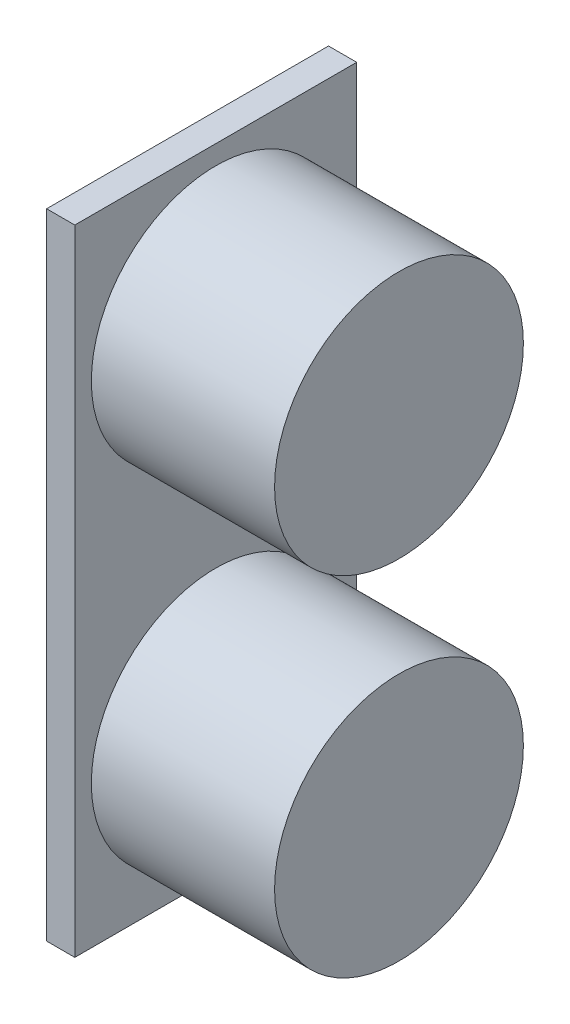
ISO-10303-21;
HEADER;
FILE_DESCRIPTION(('STEP AP214'),'2;1');
FILE_NAME('part.step','',(''),(''),'','','');
FILE_SCHEMA(('AUTOMOTIVE_DESIGN { 1 0 10303 214 1 1 1 1 }'));
ENDSEC;
DATA;
#1=APPLICATION_CONTEXT('core data for automotive mechanical design processes');
#2=APPLICATION_PROTOCOL_DEFINITION('international standard','automotive_design',2000,#1);
#3=PRODUCT_CONTEXT('',#1,'mechanical');
#4=PRODUCT('Part','Part','',(#3));
#5=PRODUCT_RELATED_PRODUCT_CATEGORY('part','',(#4));
#6=PRODUCT_DEFINITION_FORMATION('','',#4);
#7=PRODUCT_DEFINITION_CONTEXT('part definition',#1,'design');
#8=PRODUCT_DEFINITION('design','',#6,#7);
#9=PRODUCT_DEFINITION_SHAPE('','',#8);
#10=(LENGTH_UNIT() NAMED_UNIT(*) SI_UNIT(.MILLI.,.METRE.));
#11=(NAMED_UNIT(*) PLANE_ANGLE_UNIT() SI_UNIT($,.RADIAN.));
#12=(NAMED_UNIT(*) SI_UNIT($,.STERADIAN.) SOLID_ANGLE_UNIT());
#13=UNCERTAINTY_MEASURE_WITH_UNIT(LENGTH_MEASURE(1.E-05),#10,'distance_accuracy_value','');
#14=(GEOMETRIC_REPRESENTATION_CONTEXT(3) GLOBAL_UNCERTAINTY_ASSIGNED_CONTEXT((#13)) GLOBAL_UNIT_ASSIGNED_CONTEXT((#10,
#11,#12)) REPRESENTATION_CONTEXT('',''));
#15=CARTESIAN_POINT('',(0.,0.,0.));
#16=DIRECTION('',(0.,0.,1.));
#17=DIRECTION('',(1.,0.,0.));
#18=AXIS2_PLACEMENT_3D('',#15,#16,#17);
#19=CARTESIAN_POINT('',(2.,0.,0.));
#20=DIRECTION('',(0.,1.,0.));
#21=DIRECTION('',(0.,0.,1.));
#22=AXIS2_PLACEMENT_3D('',#19,#20,#21);
#23=PLANE('',#22);
#24=DIRECTION('',(0.,0.,-1.));
#25=VECTOR('',#24,1.);
#26=CARTESIAN_POINT('',(0.,0.,0.));
#27=LINE('',#26,#25);
#28=CARTESIAN_POINT('',(0.,0.,20.));
#29=VERTEX_POINT('',#28);
#30=CARTESIAN_POINT('',(0.,0.,0.));
#31=VERTEX_POINT('',#30);
#32=EDGE_CURVE('E117',#29,#31,#27,.T.);
#33=ORIENTED_EDGE('',*,*,#32,.T.);
#34=DIRECTION('',(-1.,0.,0.));
#35=VECTOR('',#34,1.);
#36=CARTESIAN_POINT('',(2.,0.,0.));
#37=LINE('',#36,#35);
#38=CARTESIAN_POINT('',(2.,0.,0.));
#39=VERTEX_POINT('',#38);
#40=EDGE_CURVE('E106',#39,#31,#37,.T.);
#41=ORIENTED_EDGE('',*,*,#40,.F.);
#42=DIRECTION('',(0.,0.,-1.));
#43=VECTOR('',#42,1.);
#44=CARTESIAN_POINT('',(2.,0.,0.));
#45=LINE('',#44,#43);
#46=CARTESIAN_POINT('',(2.,0.,20.));
#47=VERTEX_POINT('',#46);
#48=EDGE_CURVE('E98',#47,#39,#45,.T.);
#49=ORIENTED_EDGE('',*,*,#48,.F.);
#50=DIRECTION('',(-1.,0.,0.));
#51=VECTOR('',#50,1.);
#52=CARTESIAN_POINT('',(2.,0.,20.));
#53=LINE('',#52,#51);
#54=EDGE_CURVE('E113',#47,#29,#53,.T.);
#55=ORIENTED_EDGE('',*,*,#54,.T.);
#56=EDGE_LOOP('',(#33,#41,#49,#55));
#57=FACE_BOUND('',#56,.T.);
#58=ADVANCED_FACE('F45',(#57),#23,.F.);
#59=CARTESIAN_POINT('',(2.,0.,0.));
#60=DIRECTION('',(0.,0.,1.));
#61=DIRECTION('',(1.,0.,0.));
#62=AXIS2_PLACEMENT_3D('',#59,#60,#61);
#63=PLANE('',#62);
#64=DIRECTION('',(0.,1.,0.));
#65=VECTOR('',#64,1.);
#66=CARTESIAN_POINT('',(0.,0.,0.));
#67=LINE('',#66,#65);
#68=CARTESIAN_POINT('',(0.,45.,0.));
#69=VERTEX_POINT('',#68);
#70=EDGE_CURVE('E104',#31,#69,#67,.T.);
#71=ORIENTED_EDGE('',*,*,#70,.T.);
#72=DIRECTION('',(-1.,0.,0.));
#73=VECTOR('',#72,1.);
#74=CARTESIAN_POINT('',(2.,45.,0.));
#75=LINE('',#74,#73);
#76=CARTESIAN_POINT('',(2.,45.,0.));
#77=VERTEX_POINT('',#76);
#78=EDGE_CURVE('E102',#77,#69,#75,.T.);
#79=ORIENTED_EDGE('',*,*,#78,.F.);
#80=DIRECTION('',(0.,1.,0.));
#81=VECTOR('',#80,1.);
#82=CARTESIAN_POINT('',(2.,0.,0.));
#83=LINE('',#82,#81);
#84=EDGE_CURVE('E93',#39,#77,#83,.T.);
#85=ORIENTED_EDGE('',*,*,#84,.F.);
#86=ORIENTED_EDGE('',*,*,#40,.T.);
#87=EDGE_LOOP('',(#71,#79,#85,#86));
#88=FACE_BOUND('',#87,.T.);
#89=ADVANCED_FACE('F103',(#88),#63,.F.);
#90=CARTESIAN_POINT('',(2.,45.,0.));
#91=DIRECTION('',(0.,-1.,0.));
#92=DIRECTION('',(0.,0.,-1.));
#93=AXIS2_PLACEMENT_3D('',#90,#91,#92);
#94=PLANE('',#93);
#95=DIRECTION('',(0.,0.,1.));
#96=VECTOR('',#95,1.);
#97=CARTESIAN_POINT('',(0.,45.,0.));
#98=LINE('',#97,#96);
#99=CARTESIAN_POINT('',(0.,45.,20.));
#100=VERTEX_POINT('',#99);
#101=EDGE_CURVE('E79',#69,#100,#98,.T.);
#102=ORIENTED_EDGE('',*,*,#101,.T.);
#103=DIRECTION('',(-1.,0.,0.));
#104=VECTOR('',#103,1.);
#105=CARTESIAN_POINT('',(2.,45.,20.));
#106=LINE('',#105,#104);
#107=CARTESIAN_POINT('',(2.,45.,20.));
#108=VERTEX_POINT('',#107);
#109=EDGE_CURVE('E107',#108,#100,#106,.T.);
#110=ORIENTED_EDGE('',*,*,#109,.F.);
#111=DIRECTION('',(0.,0.,1.));
#112=VECTOR('',#111,1.);
#113=CARTESIAN_POINT('',(2.,45.,0.));
#114=LINE('',#113,#112);
#115=EDGE_CURVE('E96',#77,#108,#114,.T.);
#116=ORIENTED_EDGE('',*,*,#115,.F.);
#117=ORIENTED_EDGE('',*,*,#78,.T.);
#118=EDGE_LOOP('',(#102,#110,#116,#117));
#119=FACE_BOUND('',#118,.T.);
#120=ADVANCED_FACE('F109',(#119),#94,.F.);
#121=CARTESIAN_POINT('',(2.,0.,20.));
#122=DIRECTION('',(0.,0.,-1.));
#123=DIRECTION('',(-1.,0.,0.));
#124=AXIS2_PLACEMENT_3D('',#121,#122,#123);
#125=PLANE('',#124);
#126=DIRECTION('',(0.,-1.,0.));
#127=VECTOR('',#126,1.);
#128=CARTESIAN_POINT('',(0.,0.,20.));
#129=LINE('',#128,#127);
#130=EDGE_CURVE('E85',#100,#29,#129,.T.);
#131=ORIENTED_EDGE('',*,*,#130,.T.);
#132=ORIENTED_EDGE('',*,*,#54,.F.);
#133=DIRECTION('',(0.,-1.,0.));
#134=VECTOR('',#133,1.);
#135=CARTESIAN_POINT('',(2.,0.,20.));
#136=LINE('',#135,#134);
#137=EDGE_CURVE('E62',#108,#47,#136,.T.);
#138=ORIENTED_EDGE('',*,*,#137,.F.);
#139=ORIENTED_EDGE('',*,*,#109,.T.);
#140=EDGE_LOOP('',(#131,#132,#138,#139));
#141=FACE_BOUND('',#140,.T.);
#142=ADVANCED_FACE('F141',(#141),#125,.F.);
#143=CARTESIAN_POINT('',(2.,0.,0.));
#144=DIRECTION('',(-1.,0.,0.));
#145=DIRECTION('',(0.,0.,1.));
#146=AXIS2_PLACEMENT_3D('',#143,#144,#145);
#147=PLANE('',#146);
#148=CARTESIAN_POINT('',(2.,34.8146833251682,10.));
#149=DIRECTION('',(-1.,0.,0.));
#150=DIRECTION('',(0.,0.,1.));
#151=AXIS2_PLACEMENT_3D('',#148,#149,#150);
#152=CIRCLE('',#151,8.82628422603186);
#153=CARTESIAN_POINT('',(2.,34.8146833251682,18.8262842260319));
#154=VERTEX_POINT('',#153);
#155=EDGE_CURVE('E11',#154,#154,#152,.F.);
#156=ORIENTED_EDGE('',*,*,#155,.F.);
#157=EDGE_LOOP('',(#156));
#158=FACE_BOUND('',#157,.T.);
#159=CARTESIAN_POINT('',(2.,10.0962767318712,10.));
#160=DIRECTION('',(-1.,0.,0.));
#161=DIRECTION('',(0.,0.,1.));
#162=AXIS2_PLACEMENT_3D('',#159,#160,#161);
#163=CIRCLE('',#162,8.82628422603186);
#164=CARTESIAN_POINT('',(2.,10.0962767318712,18.8262842260319));
#165=VERTEX_POINT('',#164);
#166=EDGE_CURVE('E54',#165,#165,#163,.F.);
#167=ORIENTED_EDGE('',*,*,#166,.F.);
#168=EDGE_LOOP('',(#167));
#169=FACE_BOUND('',#168,.T.);
#170=ORIENTED_EDGE('',*,*,#48,.T.);
#171=ORIENTED_EDGE('',*,*,#84,.T.);
#172=ORIENTED_EDGE('',*,*,#115,.T.);
#173=ORIENTED_EDGE('',*,*,#137,.T.);
#174=EDGE_LOOP('',(#170,#171,#172,#173));
#175=FACE_BOUND('',#174,.T.);
#176=ADVANCED_FACE('F94',(#158,#169,#175),#147,.F.);
#177=CARTESIAN_POINT('',(0.,0.,0.));
#178=DIRECTION('',(-1.,0.,0.));
#179=DIRECTION('',(0.,0.,1.));
#180=AXIS2_PLACEMENT_3D('',#177,#178,#179);
#181=PLANE('',#180);
#182=ORIENTED_EDGE('',*,*,#32,.F.);
#183=ORIENTED_EDGE('',*,*,#130,.F.);
#184=ORIENTED_EDGE('',*,*,#101,.F.);
#185=ORIENTED_EDGE('',*,*,#70,.F.);
#186=EDGE_LOOP('',(#182,#183,#184,#185));
#187=FACE_BOUND('',#186,.T.);
#188=ADVANCED_FACE('F140',(#187),#181,.T.);
#189=CARTESIAN_POINT('',(15.,10.0962767318712,10.));
#190=DIRECTION('',(-1.,0.,0.));
#191=DIRECTION('',(0.,0.,1.));
#192=AXIS2_PLACEMENT_3D('',#189,#190,#191);
#193=CYLINDRICAL_SURFACE('',#192,8.82628422603186);
#194=CARTESIAN_POINT('',(15.,10.0962767318712,10.));
#195=DIRECTION('',(1.,0.,0.));
#196=DIRECTION('',(0.,0.,-1.));
#197=AXIS2_PLACEMENT_3D('',#194,#195,#196);
#198=CIRCLE('',#197,8.82628422603186);
#199=CARTESIAN_POINT('',(15.,10.0962767318712,18.8262842260319));
#200=VERTEX_POINT('',#199);
#201=EDGE_CURVE('E121',#200,#200,#198,.T.);
#202=CARTESIAN_POINT('',(15.,10.0962767318712,18.8262842260319));
#203=CARTESIAN_POINT('',(14.8645833333333,10.0962767318712,18.8262842260319));
#204=CARTESIAN_POINT('',(14.7291666666667,10.0962767318712,18.8262842260319));
#205=CARTESIAN_POINT('',(14.4583333333333,10.0962767318712,18.8262842260319));
#206=CARTESIAN_POINT('',(14.3229166666667,10.0962767318712,18.8262842260319));
#207=CARTESIAN_POINT('',(14.0520833333333,10.0962767318712,18.8262842260319));
#208=CARTESIAN_POINT('',(13.9166666666667,10.0962767318712,18.8262842260319));
#209=CARTESIAN_POINT('',(13.6458333333333,10.0962767318712,18.8262842260319));
#210=CARTESIAN_POINT('',(13.5104166666667,10.0962767318712,18.8262842260319));
#211=CARTESIAN_POINT('',(13.2395833333333,10.0962767318712,18.8262842260319));
#212=CARTESIAN_POINT('',(13.1041666666667,10.0962767318712,18.8262842260319));
#213=CARTESIAN_POINT('',(12.8333333333333,10.0962767318712,18.8262842260319));
#214=CARTESIAN_POINT('',(12.6979166666667,10.0962767318712,18.8262842260319));
#215=CARTESIAN_POINT('',(12.4270833333333,10.0962767318712,18.8262842260319));
#216=CARTESIAN_POINT('',(12.2916666666667,10.0962767318712,18.8262842260319));
#217=CARTESIAN_POINT('',(12.0208333333333,10.0962767318712,18.8262842260319));
#218=CARTESIAN_POINT('',(11.8854166666667,10.0962767318712,18.8262842260319));
#219=CARTESIAN_POINT('',(11.6145833333333,10.0962767318712,18.8262842260319));
#220=CARTESIAN_POINT('',(11.4791666666667,10.0962767318712,18.8262842260319));
#221=CARTESIAN_POINT('',(11.2083333333333,10.0962767318712,18.8262842260319));
#222=CARTESIAN_POINT('',(11.0729166666667,10.0962767318712,18.8262842260319));
#223=CARTESIAN_POINT('',(10.8020833333333,10.0962767318712,18.8262842260319));
#224=CARTESIAN_POINT('',(10.6666666666667,10.0962767318712,18.8262842260319));
#225=CARTESIAN_POINT('',(10.3958333333333,10.0962767318712,18.8262842260319));
#226=CARTESIAN_POINT('',(10.2604166666667,10.0962767318712,18.8262842260319));
#227=CARTESIAN_POINT('',(9.98958333333333,10.0962767318712,18.8262842260319));
#228=CARTESIAN_POINT('',(9.85416666666667,10.0962767318712,18.8262842260319));
#229=CARTESIAN_POINT('',(9.58333333333333,10.0962767318712,18.8262842260319));
#230=CARTESIAN_POINT('',(9.44791666666667,10.0962767318712,18.8262842260319));
#231=CARTESIAN_POINT('',(9.17708333333333,10.0962767318712,18.8262842260319));
#232=CARTESIAN_POINT('',(9.04166666666667,10.0962767318712,18.8262842260319));
#233=CARTESIAN_POINT('',(8.77083333333333,10.0962767318712,18.8262842260319));
#234=CARTESIAN_POINT('',(8.63541666666667,10.0962767318712,18.8262842260319));
#235=CARTESIAN_POINT('',(8.36458333333333,10.0962767318712,18.8262842260319));
#236=CARTESIAN_POINT('',(8.22916666666667,10.0962767318712,18.8262842260319));
#237=CARTESIAN_POINT('',(7.95833333333333,10.0962767318712,18.8262842260319));
#238=CARTESIAN_POINT('',(7.82291666666667,10.0962767318712,18.8262842260319));
#239=CARTESIAN_POINT('',(7.55208333333333,10.0962767318712,18.8262842260319));
#240=CARTESIAN_POINT('',(7.41666666666667,10.0962767318712,18.8262842260319));
#241=CARTESIAN_POINT('',(7.14583333333333,10.0962767318712,18.8262842260319));
#242=CARTESIAN_POINT('',(7.01041666666667,10.0962767318712,18.8262842260319));
#243=CARTESIAN_POINT('',(6.73958333333333,10.0962767318712,18.8262842260319));
#244=CARTESIAN_POINT('',(6.60416666666667,10.0962767318712,18.8262842260319));
#245=CARTESIAN_POINT('',(6.33333333333333,10.0962767318712,18.8262842260319));
#246=CARTESIAN_POINT('',(6.19791666666667,10.0962767318712,18.8262842260319));
#247=CARTESIAN_POINT('',(5.92708333333333,10.0962767318712,18.8262842260319));
#248=CARTESIAN_POINT('',(5.79166666666667,10.0962767318712,18.8262842260319));
#249=CARTESIAN_POINT('',(5.52083333333333,10.0962767318712,18.8262842260319));
#250=CARTESIAN_POINT('',(5.38541666666667,10.0962767318712,18.8262842260319));
#251=CARTESIAN_POINT('',(5.11458333333333,10.0962767318712,18.8262842260319));
#252=CARTESIAN_POINT('',(4.97916666666667,10.0962767318712,18.8262842260319));
#253=CARTESIAN_POINT('',(4.70833333333333,10.0962767318712,18.8262842260319));
#254=CARTESIAN_POINT('',(4.57291666666667,10.0962767318712,18.8262842260319));
#255=CARTESIAN_POINT('',(4.30208333333333,10.0962767318712,18.8262842260319));
#256=CARTESIAN_POINT('',(4.16666666666667,10.0962767318712,18.8262842260319));
#257=CARTESIAN_POINT('',(3.89583333333333,10.0962767318712,18.8262842260319));
#258=CARTESIAN_POINT('',(3.76041666666667,10.0962767318712,18.8262842260319));
#259=CARTESIAN_POINT('',(3.48958333333333,10.0962767318712,18.8262842260319));
#260=CARTESIAN_POINT('',(3.35416666666667,10.0962767318712,18.8262842260319));
#261=CARTESIAN_POINT('',(3.08333333333333,10.0962767318712,18.8262842260319));
#262=CARTESIAN_POINT('',(2.94791666666667,10.0962767318712,18.8262842260319));
#263=CARTESIAN_POINT('',(2.67708333333333,10.0962767318712,18.8262842260319));
#264=CARTESIAN_POINT('',(2.54166666666667,10.0962767318712,18.8262842260319));
#265=CARTESIAN_POINT('',(2.27083333333333,10.0962767318712,18.8262842260319));
#266=CARTESIAN_POINT('',(2.13541666666667,10.0962767318712,18.8262842260319));
#267=CARTESIAN_POINT('',(2.,10.0962767318712,18.8262842260319));
#268=B_SPLINE_CURVE_WITH_KNOTS('',3,(#202,#203,#204,#205,#206,#207,#208,#209,#210,#211,#212,
#213,#214,#215,#216,#217,#218,#219,#220,#221,#222,#223,#224,#225,#226,#227,#228,#229,#230,#231,
#232,#233,#234,#235,#236,#237,#238,#239,#240,#241,#242,#243,#244,#245,#246,#247,#248,#249,#250,
#251,#252,#253,#254,#255,#256,#257,#258,#259,#260,#261,#262,#263,#264,#265,#266,#267),
.UNSPECIFIED.,.F.,.F.,(4,2,2,2,2,2,2,2,2,2,2,2,2,2,2,2,2,2,2,2,2,2,2,2,2,2,2,2,2,2,2,2,4),(0.,
0.406249999999999,0.812499999999999,1.21875,1.625,2.03125,2.4375,2.84375,3.25,3.65625,4.0625,
4.46875,4.875,5.28125,5.6875,6.09375,6.5,6.90625,7.3125,7.71875,8.125,8.53125,8.9375,9.34375,
9.75,10.15625,10.5625,10.96875,11.375,11.78125,12.1875,12.59375,13.),.UNSPECIFIED.);
#269=EDGE_CURVE('BSEAM137',#200,#165,#268,.T.);
#270=ORIENTED_EDGE('',*,*,#201,.F.);
#271=ORIENTED_EDGE('',*,*,#166,.T.);
#272=ORIENTED_EDGE('',*,*,#269,.T.);
#273=ORIENTED_EDGE('',*,*,#269,.F.);
#274=EDGE_LOOP('',(#270,#272,#271,#273));
#275=FACE_BOUND('',#274,.T.);
#276=ADVANCED_FACE('F137',(#275),#193,.T.);
#277=CARTESIAN_POINT('',(15.,10.0962767318712,10.));
#278=DIRECTION('',(1.,0.,0.));
#279=DIRECTION('',(0.,0.,-1.));
#280=AXIS2_PLACEMENT_3D('',#277,#278,#279);
#281=PLANE('',#280);
#282=ORIENTED_EDGE('',*,*,#201,.T.);
#283=EDGE_LOOP('',(#282));
#284=FACE_BOUND('',#283,.T.);
#285=ADVANCED_FACE('F175',(#284),#281,.T.);
#286=CARTESIAN_POINT('',(15.,34.8146833251682,10.));
#287=DIRECTION('',(-1.,0.,0.));
#288=DIRECTION('',(0.,0.,1.));
#289=AXIS2_PLACEMENT_3D('',#286,#287,#288);
#290=CYLINDRICAL_SURFACE('',#289,8.82628422603186);
#291=CARTESIAN_POINT('',(15.,34.8146833251682,10.));
#292=DIRECTION('',(1.,0.,0.));
#293=DIRECTION('',(0.,0.,-1.));
#294=AXIS2_PLACEMENT_3D('',#291,#292,#293);
#295=CIRCLE('',#294,8.82628422603186);
#296=CARTESIAN_POINT('',(15.,34.8146833251682,18.8262842260319));
#297=VERTEX_POINT('',#296);
#298=EDGE_CURVE('E166',#297,#297,#295,.T.);
#299=CARTESIAN_POINT('',(15.,34.8146833251682,18.8262842260319));
#300=CARTESIAN_POINT('',(14.8645833333333,34.8146833251682,18.8262842260319));
#301=CARTESIAN_POINT('',(14.7291666666667,34.8146833251682,18.8262842260319));
#302=CARTESIAN_POINT('',(14.4583333333333,34.8146833251682,18.8262842260319));
#303=CARTESIAN_POINT('',(14.3229166666667,34.8146833251682,18.8262842260319));
#304=CARTESIAN_POINT('',(14.0520833333333,34.8146833251682,18.8262842260319));
#305=CARTESIAN_POINT('',(13.9166666666667,34.8146833251682,18.8262842260319));
#306=CARTESIAN_POINT('',(13.6458333333333,34.8146833251682,18.8262842260319));
#307=CARTESIAN_POINT('',(13.5104166666667,34.8146833251682,18.8262842260319));
#308=CARTESIAN_POINT('',(13.2395833333333,34.8146833251682,18.8262842260319));
#309=CARTESIAN_POINT('',(13.1041666666667,34.8146833251682,18.8262842260319));
#310=CARTESIAN_POINT('',(12.8333333333333,34.8146833251682,18.8262842260319));
#311=CARTESIAN_POINT('',(12.6979166666667,34.8146833251682,18.8262842260319));
#312=CARTESIAN_POINT('',(12.4270833333333,34.8146833251682,18.8262842260319));
#313=CARTESIAN_POINT('',(12.2916666666667,34.8146833251682,18.8262842260319));
#314=CARTESIAN_POINT('',(12.0208333333333,34.8146833251682,18.8262842260319));
#315=CARTESIAN_POINT('',(11.8854166666667,34.8146833251682,18.8262842260319));
#316=CARTESIAN_POINT('',(11.6145833333333,34.8146833251682,18.8262842260319));
#317=CARTESIAN_POINT('',(11.4791666666667,34.8146833251682,18.8262842260319));
#318=CARTESIAN_POINT('',(11.2083333333333,34.8146833251682,18.8262842260319));
#319=CARTESIAN_POINT('',(11.0729166666667,34.8146833251682,18.8262842260319));
#320=CARTESIAN_POINT('',(10.8020833333333,34.8146833251682,18.8262842260319));
#321=CARTESIAN_POINT('',(10.6666666666667,34.8146833251682,18.8262842260319));
#322=CARTESIAN_POINT('',(10.3958333333333,34.8146833251682,18.8262842260319));
#323=CARTESIAN_POINT('',(10.2604166666667,34.8146833251682,18.8262842260319));
#324=CARTESIAN_POINT('',(9.98958333333333,34.8146833251682,18.8262842260319));
#325=CARTESIAN_POINT('',(9.85416666666667,34.8146833251682,18.8262842260319));
#326=CARTESIAN_POINT('',(9.58333333333333,34.8146833251682,18.8262842260319));
#327=CARTESIAN_POINT('',(9.44791666666667,34.8146833251682,18.8262842260319));
#328=CARTESIAN_POINT('',(9.17708333333333,34.8146833251682,18.8262842260319));
#329=CARTESIAN_POINT('',(9.04166666666667,34.8146833251682,18.8262842260319));
#330=CARTESIAN_POINT('',(8.77083333333333,34.8146833251682,18.8262842260319));
#331=CARTESIAN_POINT('',(8.63541666666667,34.8146833251682,18.8262842260319));
#332=CARTESIAN_POINT('',(8.36458333333333,34.8146833251682,18.8262842260319));
#333=CARTESIAN_POINT('',(8.22916666666667,34.8146833251682,18.8262842260319));
#334=CARTESIAN_POINT('',(7.95833333333333,34.8146833251682,18.8262842260319));
#335=CARTESIAN_POINT('',(7.82291666666667,34.8146833251682,18.8262842260319));
#336=CARTESIAN_POINT('',(7.55208333333333,34.8146833251682,18.8262842260319));
#337=CARTESIAN_POINT('',(7.41666666666667,34.8146833251682,18.8262842260319));
#338=CARTESIAN_POINT('',(7.14583333333333,34.8146833251682,18.8262842260319));
#339=CARTESIAN_POINT('',(7.01041666666667,34.8146833251682,18.8262842260319));
#340=CARTESIAN_POINT('',(6.73958333333333,34.8146833251682,18.8262842260319));
#341=CARTESIAN_POINT('',(6.60416666666667,34.8146833251682,18.8262842260319));
#342=CARTESIAN_POINT('',(6.33333333333333,34.8146833251682,18.8262842260319));
#343=CARTESIAN_POINT('',(6.19791666666667,34.8146833251682,18.8262842260319));
#344=CARTESIAN_POINT('',(5.92708333333333,34.8146833251682,18.8262842260319));
#345=CARTESIAN_POINT('',(5.79166666666667,34.8146833251682,18.8262842260319));
#346=CARTESIAN_POINT('',(5.52083333333333,34.8146833251682,18.8262842260319));
#347=CARTESIAN_POINT('',(5.38541666666667,34.8146833251682,18.8262842260319));
#348=CARTESIAN_POINT('',(5.11458333333333,34.8146833251682,18.8262842260319));
#349=CARTESIAN_POINT('',(4.97916666666667,34.8146833251682,18.8262842260319));
#350=CARTESIAN_POINT('',(4.70833333333333,34.8146833251682,18.8262842260319));
#351=CARTESIAN_POINT('',(4.57291666666667,34.8146833251682,18.8262842260319));
#352=CARTESIAN_POINT('',(4.30208333333333,34.8146833251682,18.8262842260319));
#353=CARTESIAN_POINT('',(4.16666666666667,34.8146833251682,18.8262842260319));
#354=CARTESIAN_POINT('',(3.89583333333333,34.8146833251682,18.8262842260319));
#355=CARTESIAN_POINT('',(3.76041666666667,34.8146833251682,18.8262842260319));
#356=CARTESIAN_POINT('',(3.48958333333333,34.8146833251682,18.8262842260319));
#357=CARTESIAN_POINT('',(3.35416666666667,34.8146833251682,18.8262842260319));
#358=CARTESIAN_POINT('',(3.08333333333333,34.8146833251682,18.8262842260319));
#359=CARTESIAN_POINT('',(2.94791666666667,34.8146833251682,18.8262842260319));
#360=CARTESIAN_POINT('',(2.67708333333333,34.8146833251682,18.8262842260319));
#361=CARTESIAN_POINT('',(2.54166666666667,34.8146833251682,18.8262842260319));
#362=CARTESIAN_POINT('',(2.27083333333333,34.8146833251682,18.8262842260319));
#363=CARTESIAN_POINT('',(2.13541666666667,34.8146833251682,18.8262842260319));
#364=CARTESIAN_POINT('',(2.,34.8146833251682,18.8262842260319));
#365=B_SPLINE_CURVE_WITH_KNOTS('',3,(#299,#300,#301,#302,#303,#304,#305,#306,#307,#308,#309,
#310,#311,#312,#313,#314,#315,#316,#317,#318,#319,#320,#321,#322,#323,#324,#325,#326,#327,#328,
#329,#330,#331,#332,#333,#334,#335,#336,#337,#338,#339,#340,#341,#342,#343,#344,#345,#346,#347,
#348,#349,#350,#351,#352,#353,#354,#355,#356,#357,#358,#359,#360,#361,#362,#363,#364),
.UNSPECIFIED.,.F.,.F.,(4,2,2,2,2,2,2,2,2,2,2,2,2,2,2,2,2,2,2,2,2,2,2,2,2,2,2,2,2,2,2,2,4),(0.,
0.406249999999999,0.812499999999999,1.21875,1.625,2.03125,2.4375,2.84375,3.25,3.65625,4.0625,
4.46875,4.875,5.28125,5.6875,6.09375,6.5,6.90625,7.3125,7.71875,8.125,8.53125,8.9375,9.34375,
9.75,10.15625,10.5625,10.96875,11.375,11.78125,12.1875,12.59375,13.),.UNSPECIFIED.);
#366=EDGE_CURVE('BSEAM173',#297,#154,#365,.T.);
#367=ORIENTED_EDGE('',*,*,#298,.F.);
#368=ORIENTED_EDGE('',*,*,#155,.T.);
#369=ORIENTED_EDGE('',*,*,#366,.T.);
#370=ORIENTED_EDGE('',*,*,#366,.F.);
#371=EDGE_LOOP('',(#367,#369,#368,#370));
#372=FACE_BOUND('',#371,.T.);
#373=ADVANCED_FACE('F173',(#372),#290,.T.);
#374=CARTESIAN_POINT('',(15.,34.8146833251682,10.));
#375=DIRECTION('',(1.,0.,0.));
#376=DIRECTION('',(0.,0.,-1.));
#377=AXIS2_PLACEMENT_3D('',#374,#375,#376);
#378=PLANE('',#377);
#379=ORIENTED_EDGE('',*,*,#298,.T.);
#380=EDGE_LOOP('',(#379));
#381=FACE_BOUND('',#380,.T.);
#382=ADVANCED_FACE('F171',(#381),#378,.T.);
#383=CLOSED_SHELL('',(#58,#89,#120,#142,#176,#188,#276,#285,#373,#382));
#384=MANIFOLD_SOLID_BREP('B2',#383);
#385=ADVANCED_BREP_SHAPE_REPRESENTATION('',(#18,#384),#14);
#386=SHAPE_DEFINITION_REPRESENTATION(#9,#385);
ENDSEC;
END-ISO-10303-21;
